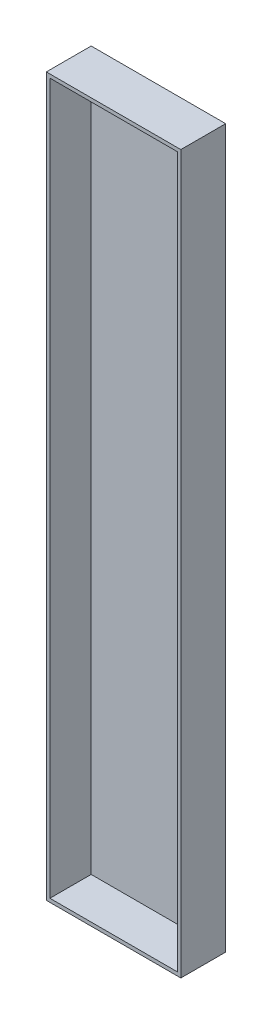
ISO-10303-21;
HEADER;
FILE_DESCRIPTION(('STEP AP214'),'2;1');
FILE_NAME('part.step','',(''),(''),'','','');
FILE_SCHEMA(('AUTOMOTIVE_DESIGN { 1 0 10303 214 1 1 1 1 }'));
ENDSEC;
DATA;
#1=APPLICATION_CONTEXT('core data for automotive mechanical design processes');
#2=APPLICATION_PROTOCOL_DEFINITION('international standard','automotive_design',2000,#1);
#3=PRODUCT_CONTEXT('',#1,'mechanical');
#4=PRODUCT('Part','Part','',(#3));
#5=PRODUCT_RELATED_PRODUCT_CATEGORY('part','',(#4));
#6=PRODUCT_DEFINITION_FORMATION('','',#4);
#7=PRODUCT_DEFINITION_CONTEXT('part definition',#1,'design');
#8=PRODUCT_DEFINITION('design','',#6,#7);
#9=PRODUCT_DEFINITION_SHAPE('','',#8);
#10=(LENGTH_UNIT() NAMED_UNIT(*) SI_UNIT(.MILLI.,.METRE.));
#11=(NAMED_UNIT(*) PLANE_ANGLE_UNIT() SI_UNIT($,.RADIAN.));
#12=(NAMED_UNIT(*) SI_UNIT($,.STERADIAN.) SOLID_ANGLE_UNIT());
#13=UNCERTAINTY_MEASURE_WITH_UNIT(LENGTH_MEASURE(1.E-05),#10,'distance_accuracy_value','');
#14=(GEOMETRIC_REPRESENTATION_CONTEXT(3) GLOBAL_UNCERTAINTY_ASSIGNED_CONTEXT((#13)) GLOBAL_UNIT_ASSIGNED_CONTEXT((#10,
#11,#12)) REPRESENTATION_CONTEXT('',''));
#15=CARTESIAN_POINT('',(0.,0.,0.));
#16=DIRECTION('',(0.,0.,1.));
#17=DIRECTION('',(1.,0.,0.));
#18=AXIS2_PLACEMENT_3D('',#15,#16,#17);
#19=CARTESIAN_POINT('',(0.,0.,50.));
#20=DIRECTION('',(1.,0.,0.));
#21=DIRECTION('',(0.,1.,0.));
#22=AXIS2_PLACEMENT_3D('',#19,#20,#21);
#23=PLANE('',#22);
#24=DIRECTION('',(0.,-1.,0.));
#25=VECTOR('',#24,1.);
#26=CARTESIAN_POINT('',(0.,0.,0.));
#27=LINE('',#26,#25);
#28=CARTESIAN_POINT('',(0.,0.,0.));
#29=VERTEX_POINT('',#28);
#30=CARTESIAN_POINT('',(0.,-800.,0.));
#31=VERTEX_POINT('',#30);
#32=EDGE_CURVE('E141',#29,#31,#27,.T.);
#33=ORIENTED_EDGE('',*,*,#32,.T.);
#34=DIRECTION('',(0.,0.,-1.));
#35=VECTOR('',#34,1.);
#36=CARTESIAN_POINT('',(0.,-800.,50.));
#37=LINE('',#36,#35);
#38=CARTESIAN_POINT('',(0.,-800.,50.));
#39=VERTEX_POINT('',#38);
#40=EDGE_CURVE('E11',#39,#31,#37,.T.);
#41=ORIENTED_EDGE('',*,*,#40,.F.);
#42=DIRECTION('',(0.,-1.,0.));
#43=VECTOR('',#42,1.);
#44=CARTESIAN_POINT('',(0.,0.,50.));
#45=LINE('',#44,#43);
#46=CARTESIAN_POINT('',(0.,0.,50.));
#47=VERTEX_POINT('',#46);
#48=EDGE_CURVE('E145',#47,#39,#45,.T.);
#49=ORIENTED_EDGE('',*,*,#48,.F.);
#50=DIRECTION('',(0.,0.,-1.));
#51=VECTOR('',#50,1.);
#52=CARTESIAN_POINT('',(0.,0.,50.));
#53=LINE('',#52,#51);
#54=EDGE_CURVE('E151',#47,#29,#53,.T.);
#55=ORIENTED_EDGE('',*,*,#54,.T.);
#56=EDGE_LOOP('',(#33,#41,#49,#55));
#57=FACE_BOUND('',#56,.T.);
#58=ADVANCED_FACE('F33',(#57),#23,.F.);
#59=CARTESIAN_POINT('',(0.,-800.,50.));
#60=DIRECTION('',(0.,1.,0.));
#61=DIRECTION('',(0.,0.,1.));
#62=AXIS2_PLACEMENT_3D('',#59,#60,#61);
#63=PLANE('',#62);
#64=DIRECTION('',(1.,0.,0.));
#65=VECTOR('',#64,1.);
#66=CARTESIAN_POINT('',(0.,-800.,0.));
#67=LINE('',#66,#65);
#68=CARTESIAN_POINT('',(150.,-800.,0.));
#69=VERTEX_POINT('',#68);
#70=EDGE_CURVE('E154',#31,#69,#67,.T.);
#71=ORIENTED_EDGE('',*,*,#70,.T.);
#72=DIRECTION('',(0.,0.,-1.));
#73=VECTOR('',#72,1.);
#74=CARTESIAN_POINT('',(150.,-800.,50.));
#75=LINE('',#74,#73);
#76=CARTESIAN_POINT('',(150.,-800.,50.));
#77=VERTEX_POINT('',#76);
#78=EDGE_CURVE('E40',#77,#69,#75,.T.);
#79=ORIENTED_EDGE('',*,*,#78,.F.);
#80=DIRECTION('',(1.,0.,0.));
#81=VECTOR('',#80,1.);
#82=CARTESIAN_POINT('',(0.,-800.,50.));
#83=LINE('',#82,#81);
#84=EDGE_CURVE('E84',#39,#77,#83,.T.);
#85=ORIENTED_EDGE('',*,*,#84,.F.);
#86=ORIENTED_EDGE('',*,*,#40,.T.);
#87=EDGE_LOOP('',(#71,#79,#85,#86));
#88=FACE_BOUND('',#87,.T.);
#89=ADVANCED_FACE('F183',(#88),#63,.F.);
#90=CARTESIAN_POINT('',(150.,0.,50.));
#91=DIRECTION('',(-1.,0.,0.));
#92=DIRECTION('',(0.,-1.,0.));
#93=AXIS2_PLACEMENT_3D('',#90,#91,#92);
#94=PLANE('',#93);
#95=DIRECTION('',(0.,1.,0.));
#96=VECTOR('',#95,1.);
#97=CARTESIAN_POINT('',(150.,0.,0.));
#98=LINE('',#97,#96);
#99=CARTESIAN_POINT('',(150.,0.,0.));
#100=VERTEX_POINT('',#99);
#101=EDGE_CURVE('E156',#69,#100,#98,.T.);
#102=ORIENTED_EDGE('',*,*,#101,.T.);
#103=DIRECTION('',(0.,0.,-1.));
#104=VECTOR('',#103,1.);
#105=CARTESIAN_POINT('',(150.,0.,50.));
#106=LINE('',#105,#104);
#107=CARTESIAN_POINT('',(150.,0.,50.));
#108=VERTEX_POINT('',#107);
#109=EDGE_CURVE('E160',#108,#100,#106,.T.);
#110=ORIENTED_EDGE('',*,*,#109,.F.);
#111=DIRECTION('',(0.,1.,0.));
#112=VECTOR('',#111,1.);
#113=CARTESIAN_POINT('',(150.,0.,50.));
#114=LINE('',#113,#112);
#115=EDGE_CURVE('E148',#77,#108,#114,.T.);
#116=ORIENTED_EDGE('',*,*,#115,.F.);
#117=ORIENTED_EDGE('',*,*,#78,.T.);
#118=EDGE_LOOP('',(#102,#110,#116,#117));
#119=FACE_BOUND('',#118,.T.);
#120=ADVANCED_FACE('F165',(#119),#94,.F.);
#121=CARTESIAN_POINT('',(0.,0.,50.));
#122=DIRECTION('',(0.,-1.,0.));
#123=DIRECTION('',(0.,0.,-1.));
#124=AXIS2_PLACEMENT_3D('',#121,#122,#123);
#125=PLANE('',#124);
#126=DIRECTION('',(-1.,0.,0.));
#127=VECTOR('',#126,1.);
#128=CARTESIAN_POINT('',(0.,0.,0.));
#129=LINE('',#128,#127);
#130=EDGE_CURVE('E77',#100,#29,#129,.T.);
#131=ORIENTED_EDGE('',*,*,#130,.T.);
#132=ORIENTED_EDGE('',*,*,#54,.F.);
#133=DIRECTION('',(-1.,0.,0.));
#134=VECTOR('',#133,1.);
#135=CARTESIAN_POINT('',(0.,0.,50.));
#136=LINE('',#135,#134);
#137=EDGE_CURVE('E56',#108,#47,#136,.T.);
#138=ORIENTED_EDGE('',*,*,#137,.F.);
#139=ORIENTED_EDGE('',*,*,#109,.T.);
#140=EDGE_LOOP('',(#131,#132,#138,#139));
#141=FACE_BOUND('',#140,.T.);
#142=ADVANCED_FACE('F173',(#141),#125,.F.);
#143=CARTESIAN_POINT('',(0.,0.,50.));
#144=DIRECTION('',(0.,0.,1.));
#145=DIRECTION('',(1.,0.,0.));
#146=AXIS2_PLACEMENT_3D('',#143,#144,#145);
#147=PLANE('',#146);
#148=DIRECTION('',(0.,-1.,0.));
#149=VECTOR('',#148,1.);
#150=CARTESIAN_POINT('',(4.,-4.,50.));
#151=LINE('',#150,#149);
#152=CARTESIAN_POINT('',(4.,-4.,50.));
#153=VERTEX_POINT('',#152);
#154=CARTESIAN_POINT('',(4.0000000000001,-796.,50.));
#155=VERTEX_POINT('',#154);
#156=EDGE_CURVE('E47',#153,#155,#151,.T.);
#157=ORIENTED_EDGE('',*,*,#156,.F.);
#158=DIRECTION('',(-1.,0.,0.));
#159=VECTOR('',#158,1.);
#160=CARTESIAN_POINT('',(4.,-4.,50.));
#161=LINE('',#160,#159);
#162=CARTESIAN_POINT('',(146.,-4.,50.));
#163=VERTEX_POINT('',#162);
#164=EDGE_CURVE('E126',#163,#153,#161,.T.);
#165=ORIENTED_EDGE('',*,*,#164,.F.);
#166=DIRECTION('',(0.,1.,0.));
#167=VECTOR('',#166,1.);
#168=CARTESIAN_POINT('',(146.,-4.,50.));
#169=LINE('',#168,#167);
#170=CARTESIAN_POINT('',(146.,-796.,50.));
#171=VERTEX_POINT('',#170);
#172=EDGE_CURVE('E129',#171,#163,#169,.T.);
#173=ORIENTED_EDGE('',*,*,#172,.F.);
#174=DIRECTION('',(1.,0.,0.));
#175=VECTOR('',#174,1.);
#176=CARTESIAN_POINT('',(4.0000000000001,-796.,50.));
#177=LINE('',#176,#175);
#178=EDGE_CURVE('E135',#155,#171,#177,.T.);
#179=ORIENTED_EDGE('',*,*,#178,.F.);
#180=EDGE_LOOP('',(#157,#165,#173,#179));
#181=FACE_BOUND('',#180,.T.);
#182=ORIENTED_EDGE('',*,*,#48,.T.);
#183=ORIENTED_EDGE('',*,*,#84,.T.);
#184=ORIENTED_EDGE('',*,*,#115,.T.);
#185=ORIENTED_EDGE('',*,*,#137,.T.);
#186=EDGE_LOOP('',(#182,#183,#184,#185));
#187=FACE_BOUND('',#186,.T.);
#188=ADVANCED_FACE('F175',(#181,#187),#147,.T.);
#189=CARTESIAN_POINT('',(0.,0.,0.));
#190=DIRECTION('',(0.,0.,1.));
#191=DIRECTION('',(1.,0.,0.));
#192=AXIS2_PLACEMENT_3D('',#189,#190,#191);
#193=PLANE('',#192);
#194=ORIENTED_EDGE('',*,*,#32,.F.);
#195=ORIENTED_EDGE('',*,*,#130,.F.);
#196=ORIENTED_EDGE('',*,*,#101,.F.);
#197=ORIENTED_EDGE('',*,*,#70,.F.);
#198=EDGE_LOOP('',(#194,#195,#196,#197));
#199=FACE_BOUND('',#198,.T.);
#200=ADVANCED_FACE('F169',(#199),#193,.F.);
#201=CARTESIAN_POINT('',(4.,-4.,4.));
#202=DIRECTION('',(-1.,0.,0.));
#203=DIRECTION('',(0.,-1.,0.));
#204=AXIS2_PLACEMENT_3D('',#201,#202,#203);
#205=PLANE('',#204);
#206=ORIENTED_EDGE('',*,*,#156,.T.);
#207=DIRECTION('',(0.,0.,1.));
#208=VECTOR('',#207,1.);
#209=CARTESIAN_POINT('',(4.0000000000001,-796.,4.));
#210=LINE('',#209,#208);
#211=CARTESIAN_POINT('',(4.0000000000001,-796.,4.));
#212=VERTEX_POINT('',#211);
#213=EDGE_CURVE('E104',#212,#155,#210,.T.);
#214=ORIENTED_EDGE('',*,*,#213,.F.);
#215=DIRECTION('',(0.,-1.,0.));
#216=VECTOR('',#215,1.);
#217=CARTESIAN_POINT('',(4.,-4.,4.));
#218=LINE('',#217,#216);
#219=CARTESIAN_POINT('',(4.,-4.,4.));
#220=VERTEX_POINT('',#219);
#221=EDGE_CURVE('E108',#220,#212,#218,.T.);
#222=ORIENTED_EDGE('',*,*,#221,.F.);
#223=DIRECTION('',(0.,0.,1.));
#224=VECTOR('',#223,1.);
#225=CARTESIAN_POINT('',(4.,-4.,4.));
#226=LINE('',#225,#224);
#227=EDGE_CURVE('E139',#220,#153,#226,.T.);
#228=ORIENTED_EDGE('',*,*,#227,.T.);
#229=EDGE_LOOP('',(#206,#214,#222,#228));
#230=FACE_BOUND('',#229,.T.);
#231=ADVANCED_FACE('F106',(#230),#205,.F.);
#232=CARTESIAN_POINT('',(4.,-4.,4.));
#233=DIRECTION('',(0.,1.,0.));
#234=DIRECTION('',(0.,0.,1.));
#235=AXIS2_PLACEMENT_3D('',#232,#233,#234);
#236=PLANE('',#235);
#237=ORIENTED_EDGE('',*,*,#164,.T.);
#238=ORIENTED_EDGE('',*,*,#227,.F.);
#239=DIRECTION('',(-1.,0.,0.));
#240=VECTOR('',#239,1.);
#241=CARTESIAN_POINT('',(4.,-4.,4.));
#242=LINE('',#241,#240);
#243=CARTESIAN_POINT('',(146.,-4.,4.));
#244=VERTEX_POINT('',#243);
#245=EDGE_CURVE('E114',#244,#220,#242,.T.);
#246=ORIENTED_EDGE('',*,*,#245,.F.);
#247=DIRECTION('',(0.,0.,1.));
#248=VECTOR('',#247,1.);
#249=CARTESIAN_POINT('',(146.,-4.,4.));
#250=LINE('',#249,#248);
#251=EDGE_CURVE('E142',#244,#163,#250,.T.);
#252=ORIENTED_EDGE('',*,*,#251,.T.);
#253=EDGE_LOOP('',(#237,#238,#246,#252));
#254=FACE_BOUND('',#253,.T.);
#255=ADVANCED_FACE('F222',(#254),#236,.F.);
#256=CARTESIAN_POINT('',(146.,-4.,4.));
#257=DIRECTION('',(1.,0.,0.));
#258=DIRECTION('',(0.,1.,0.));
#259=AXIS2_PLACEMENT_3D('',#256,#257,#258);
#260=PLANE('',#259);
#261=ORIENTED_EDGE('',*,*,#172,.T.);
#262=ORIENTED_EDGE('',*,*,#251,.F.);
#263=DIRECTION('',(0.,1.,0.));
#264=VECTOR('',#263,1.);
#265=CARTESIAN_POINT('',(146.,-4.,4.));
#266=LINE('',#265,#264);
#267=CARTESIAN_POINT('',(146.,-796.,4.));
#268=VERTEX_POINT('',#267);
#269=EDGE_CURVE('E122',#268,#244,#266,.T.);
#270=ORIENTED_EDGE('',*,*,#269,.F.);
#271=DIRECTION('',(0.,0.,1.));
#272=VECTOR('',#271,1.);
#273=CARTESIAN_POINT('',(146.,-796.,4.));
#274=LINE('',#273,#272);
#275=EDGE_CURVE('E113',#268,#171,#274,.T.);
#276=ORIENTED_EDGE('',*,*,#275,.T.);
#277=EDGE_LOOP('',(#261,#262,#270,#276));
#278=FACE_BOUND('',#277,.T.);
#279=ADVANCED_FACE('F231',(#278),#260,.F.);
#280=CARTESIAN_POINT('',(4.0000000000001,-796.,4.));
#281=DIRECTION('',(0.,-1.,0.));
#282=DIRECTION('',(0.,0.,-1.));
#283=AXIS2_PLACEMENT_3D('',#280,#281,#282);
#284=PLANE('',#283);
#285=ORIENTED_EDGE('',*,*,#178,.T.);
#286=ORIENTED_EDGE('',*,*,#275,.F.);
#287=DIRECTION('',(1.,0.,0.));
#288=VECTOR('',#287,1.);
#289=CARTESIAN_POINT('',(4.0000000000001,-796.,4.));
#290=LINE('',#289,#288);
#291=EDGE_CURVE('E117',#212,#268,#290,.T.);
#292=ORIENTED_EDGE('',*,*,#291,.F.);
#293=ORIENTED_EDGE('',*,*,#213,.T.);
#294=EDGE_LOOP('',(#285,#286,#292,#293));
#295=FACE_BOUND('',#294,.T.);
#296=ADVANCED_FACE('F118',(#295),#284,.F.);
#297=CARTESIAN_POINT('',(0.,0.,4.));
#298=DIRECTION('',(0.,0.,1.));
#299=DIRECTION('',(1.,0.,0.));
#300=AXIS2_PLACEMENT_3D('',#297,#298,#299);
#301=PLANE('',#300);
#302=ORIENTED_EDGE('',*,*,#221,.T.);
#303=ORIENTED_EDGE('',*,*,#291,.T.);
#304=ORIENTED_EDGE('',*,*,#269,.T.);
#305=ORIENTED_EDGE('',*,*,#245,.T.);
#306=EDGE_LOOP('',(#302,#303,#304,#305));
#307=FACE_BOUND('',#306,.T.);
#308=ADVANCED_FACE('F124',(#307),#301,.T.);
#309=CLOSED_SHELL('',(#58,#89,#120,#142,#188,#200,#231,#255,#279,#296,#308));
#310=MANIFOLD_SOLID_BREP('B2',#309);
#311=ADVANCED_BREP_SHAPE_REPRESENTATION('',(#18,#310),#14);
#312=SHAPE_DEFINITION_REPRESENTATION(#9,#311);
ENDSEC;
END-ISO-10303-21;
